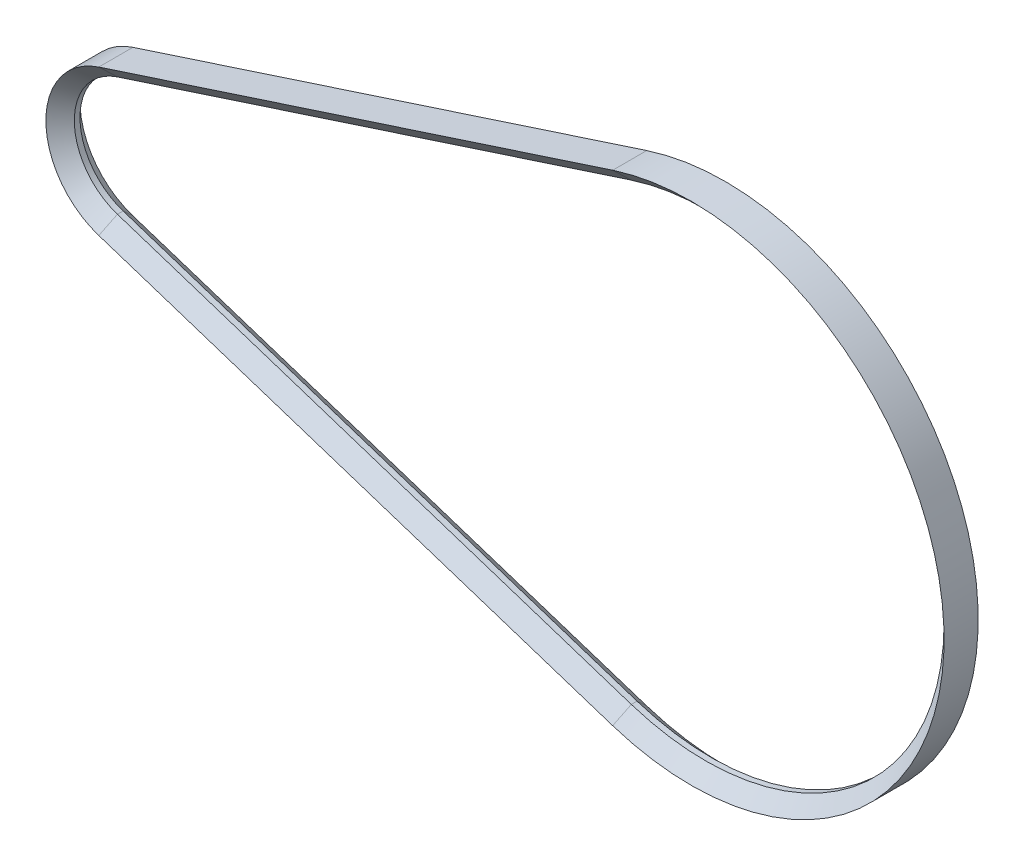
ISO-10303-21;
HEADER;
FILE_DESCRIPTION(('STEP AP214'),'2;1');
FILE_NAME('part.step','',(''),(''),'','','');
FILE_SCHEMA(('AUTOMOTIVE_DESIGN { 1 0 10303 214 1 1 1 1 }'));
ENDSEC;
DATA;
#1=APPLICATION_CONTEXT('core data for automotive mechanical design processes');
#2=APPLICATION_PROTOCOL_DEFINITION('international standard','automotive_design',2000,#1);
#3=PRODUCT_CONTEXT('',#1,'mechanical');
#4=PRODUCT('Part','Part','',(#3));
#5=PRODUCT_RELATED_PRODUCT_CATEGORY('part','',(#4));
#6=PRODUCT_DEFINITION_FORMATION('','',#4);
#7=PRODUCT_DEFINITION_CONTEXT('part definition',#1,'design');
#8=PRODUCT_DEFINITION('design','',#6,#7);
#9=PRODUCT_DEFINITION_SHAPE('','',#8);
#10=(LENGTH_UNIT() NAMED_UNIT(*) SI_UNIT(.MILLI.,.METRE.));
#11=(NAMED_UNIT(*) PLANE_ANGLE_UNIT() SI_UNIT($,.RADIAN.));
#12=(NAMED_UNIT(*) SI_UNIT($,.STERADIAN.) SOLID_ANGLE_UNIT());
#13=UNCERTAINTY_MEASURE_WITH_UNIT(LENGTH_MEASURE(1.E-05),#10,'distance_accuracy_value','');
#14=(GEOMETRIC_REPRESENTATION_CONTEXT(3) GLOBAL_UNCERTAINTY_ASSIGNED_CONTEXT((#13)) GLOBAL_UNIT_ASSIGNED_CONTEXT((#10,
#11,#12)) REPRESENTATION_CONTEXT('',''));
#15=CARTESIAN_POINT('',(0.,0.,0.));
#16=DIRECTION('',(0.,0.,1.));
#17=DIRECTION('',(1.,0.,0.));
#18=AXIS2_PLACEMENT_3D('',#15,#16,#17);
#19=CARTESIAN_POINT('',(86.2049999999994,42.307776767398,3.));
#20=DIRECTION('',(-0.219203102167829,0.672272266273119,-0.707106781186551));
#21=DIRECTION('',(0.,0.724732826664903,0.689029992057167));
#22=AXIS2_PLACEMENT_3D('',#19,#20,#21);
#23=PLANE('',#22);
#24=DIRECTION('',(0.219203102167841,-0.672272266273123,-0.707106781186544));
#25=VECTOR('',#24,1.);
#26=CARTESIAN_POINT('',(86.2049999999994,42.307776767398,3.));
#27=LINE('',#26,#25);
#28=CARTESIAN_POINT('',(86.2049999999994,42.307776767398,3.));
#29=VERTEX_POINT('',#28);
#30=CARTESIAN_POINT('',(86.9799999999994,39.9309353759711,0.500000000000023));
#31=VERTEX_POINT('',#30);
#32=EDGE_CURVE('E163',#29,#31,#27,.T.);
#33=ORIENTED_EDGE('',*,*,#32,.F.);
#34=DIRECTION('',(-0.950736556570746,-0.31,0.));
#35=VECTOR('',#34,1.);
#36=CARTESIAN_POINT('',(86.2049999999994,42.307776767398,3.));
#37=LINE('',#36,#35);
#38=CARTESIAN_POINT('',(-4.18500000000059,12.8349435137049,3.));
#39=VERTEX_POINT('',#38);
#40=EDGE_CURVE('E41',#29,#39,#37,.T.);
#41=ORIENTED_EDGE('',*,*,#40,.T.);
#42=DIRECTION('',(0.219203102167841,-0.672272266273123,-0.707106781186544));
#43=VECTOR('',#42,1.);
#44=CARTESIAN_POINT('',(-4.18500000000059,12.8349435137049,3.));
#45=LINE('',#44,#43);
#46=CARTESIAN_POINT('',(-3.41000000000057,10.458102122278,0.500000000000023));
#47=VERTEX_POINT('',#46);
#48=EDGE_CURVE('E184',#39,#47,#45,.T.);
#49=ORIENTED_EDGE('',*,*,#48,.T.);
#50=DIRECTION('',(-0.950736556570746,-0.31,0.));
#51=VECTOR('',#50,1.);
#52=CARTESIAN_POINT('',(86.9799999999994,39.9309353759711,0.500000000000023));
#53=LINE('',#52,#51);
#54=EDGE_CURVE('E11',#31,#47,#53,.T.);
#55=ORIENTED_EDGE('',*,*,#54,.F.);
#56=EDGE_LOOP('',(#33,#41,#49,#55));
#57=FACE_BOUND('',#56,.T.);
#58=ADVANCED_FACE('F33',(#57),#23,.F.);
#59=CARTESIAN_POINT('',(86.2049999999994,42.307776767398,3.));
#60=DIRECTION('',(0.31,-0.950736556570746,0.));
#61=DIRECTION('',(0.950736556570747,0.31,0.));
#62=AXIS2_PLACEMENT_3D('',#59,#60,#61);
#63=PLANE('',#62);
#64=DIRECTION('',(0.,0.,1.));
#65=VECTOR('',#64,1.);
#66=CARTESIAN_POINT('',(86.2049999999994,42.307776767398,3.));
#67=LINE('',#66,#65);
#68=CARTESIAN_POINT('',(86.2049999999994,42.307776767398,-3.));
#69=VERTEX_POINT('',#68);
#70=EDGE_CURVE('E160',#69,#29,#67,.T.);
#71=ORIENTED_EDGE('',*,*,#70,.F.);
#72=DIRECTION('',(-0.950736556570746,-0.31,0.));
#73=VECTOR('',#72,1.);
#74=CARTESIAN_POINT('',(86.2049999999994,42.307776767398,-3.));
#75=LINE('',#74,#73);
#76=CARTESIAN_POINT('',(-4.18500000000059,12.8349435137049,-3.));
#77=VERTEX_POINT('',#76);
#78=EDGE_CURVE('E190',#69,#77,#75,.T.);
#79=ORIENTED_EDGE('',*,*,#78,.T.);
#80=DIRECTION('',(0.,0.,1.));
#81=VECTOR('',#80,1.);
#82=CARTESIAN_POINT('',(-4.18500000000059,12.8349435137049,3.));
#83=LINE('',#82,#81);
#84=EDGE_CURVE('E181',#77,#39,#83,.T.);
#85=ORIENTED_EDGE('',*,*,#84,.T.);
#86=ORIENTED_EDGE('',*,*,#40,.F.);
#87=EDGE_LOOP('',(#71,#79,#85,#86));
#88=FACE_BOUND('',#87,.T.);
#89=ADVANCED_FACE('F209',(#88),#63,.F.);
#90=CARTESIAN_POINT('',(86.2049999999994,42.307776767398,-3.));
#91=DIRECTION('',(-0.219203102167829,0.67227226627312,0.70710678118655));
#92=DIRECTION('',(0.,-0.724732826664902,0.689029992057168));
#93=AXIS2_PLACEMENT_3D('',#90,#91,#92);
#94=PLANE('',#93);
#95=DIRECTION('',(-0.219203102167841,0.672272266273122,-0.707106781186545));
#96=VECTOR('',#95,1.);
#97=CARTESIAN_POINT('',(86.2049999999994,42.307776767398,-3.));
#98=LINE('',#97,#96);
#99=CARTESIAN_POINT('',(86.9799999999994,39.9309353759711,-0.500000000000021));
#100=VERTEX_POINT('',#99);
#101=EDGE_CURVE('E157',#100,#69,#98,.T.);
#102=ORIENTED_EDGE('',*,*,#101,.F.);
#103=DIRECTION('',(-0.950736556570746,-0.31,0.));
#104=VECTOR('',#103,1.);
#105=CARTESIAN_POINT('',(86.9799999999994,39.9309353759711,-0.500000000000021));
#106=LINE('',#105,#104);
#107=CARTESIAN_POINT('',(-3.41000000000057,10.458102122278,-0.500000000000021));
#108=VERTEX_POINT('',#107);
#109=EDGE_CURVE('E187',#100,#108,#106,.T.);
#110=ORIENTED_EDGE('',*,*,#109,.T.);
#111=DIRECTION('',(-0.219203102167841,0.672272266273122,-0.707106781186545));
#112=VECTOR('',#111,1.);
#113=CARTESIAN_POINT('',(-4.18500000000059,12.8349435137049,-3.));
#114=LINE('',#113,#112);
#115=EDGE_CURVE('E129',#108,#77,#114,.T.);
#116=ORIENTED_EDGE('',*,*,#115,.T.);
#117=ORIENTED_EDGE('',*,*,#78,.F.);
#118=EDGE_LOOP('',(#102,#110,#116,#117));
#119=FACE_BOUND('',#118,.T.);
#120=ADVANCED_FACE('F207',(#119),#94,.F.);
#121=CARTESIAN_POINT('',(86.9799999999994,39.9309353759711,-0.500000000000021));
#122=DIRECTION('',(-0.31,0.950736556570746,0.));
#123=DIRECTION('',(-0.950736556570747,-0.31,0.));
#124=AXIS2_PLACEMENT_3D('',#121,#122,#123);
#125=PLANE('',#124);
#126=DIRECTION('',(0.,0.,-1.));
#127=VECTOR('',#126,1.);
#128=CARTESIAN_POINT('',(86.9799999999994,39.9309353759711,-0.500000000000021));
#129=LINE('',#128,#127);
#130=EDGE_CURVE('E154',#31,#100,#129,.T.);
#131=ORIENTED_EDGE('',*,*,#130,.F.);
#132=ORIENTED_EDGE('',*,*,#54,.T.);
#133=DIRECTION('',(0.,0.,-1.));
#134=VECTOR('',#133,1.);
#135=CARTESIAN_POINT('',(-3.41000000000057,10.458102122278,-0.500000000000021));
#136=LINE('',#135,#134);
#137=EDGE_CURVE('E178',#47,#108,#136,.T.);
#138=ORIENTED_EDGE('',*,*,#137,.T.);
#139=ORIENTED_EDGE('',*,*,#109,.F.);
#140=EDGE_LOOP('',(#131,#132,#138,#139));
#141=FACE_BOUND('',#140,.T.);
#142=ADVANCED_FACE('F227',(#141),#125,.F.);
#143=CARTESIAN_POINT('',(100.,0.,3.));
#144=DIRECTION('',(0.,0.,1.));
#145=DIRECTION('',(1.,0.,0.));
#146=AXIS2_PLACEMENT_3D('',#143,#144,#145);
#147=CONICAL_SURFACE('',#146,44.5,0.785398163397454);
#148=DIRECTION('',(0.21920310216783,0.672272266273126,-0.707106781186544));
#149=VECTOR('',#148,1.);
#150=CARTESIAN_POINT('',(86.205,-42.3077767673982,3.));
#151=LINE('',#150,#149);
#152=CARTESIAN_POINT('',(86.205,-42.3077767673982,3.));
#153=VERTEX_POINT('',#152);
#154=CARTESIAN_POINT('',(86.98,-39.9309353759713,0.500000000000023));
#155=VERTEX_POINT('',#154);
#156=EDGE_CURVE('E114',#153,#155,#151,.T.);
#157=ORIENTED_EDGE('',*,*,#156,.F.);
#158=CARTESIAN_POINT('',(100.,0.,3.));
#159=DIRECTION('',(0.,0.,1.));
#160=DIRECTION('',(1.,0.,0.));
#161=AXIS2_PLACEMENT_3D('',#158,#159,#160);
#162=CIRCLE('',#161,44.5);
#163=EDGE_CURVE('E172',#153,#29,#162,.T.);
#164=ORIENTED_EDGE('',*,*,#163,.T.);
#165=ORIENTED_EDGE('',*,*,#32,.T.);
#166=CARTESIAN_POINT('',(100.,0.,0.500000000000023));
#167=DIRECTION('',(0.,0.,1.));
#168=DIRECTION('',(1.,0.,0.));
#169=AXIS2_PLACEMENT_3D('',#166,#167,#168);
#170=CIRCLE('',#169,42.);
#171=EDGE_CURVE('E175',#155,#31,#170,.T.);
#172=ORIENTED_EDGE('',*,*,#171,.F.);
#173=EDGE_LOOP('',(#157,#164,#165,#172));
#174=FACE_BOUND('',#173,.T.);
#175=ADVANCED_FACE('F230',(#174),#147,.F.);
#176=CARTESIAN_POINT('',(100.,0.,0.));
#177=DIRECTION('',(0.,0.,1.));
#178=DIRECTION('',(1.,0.,0.));
#179=AXIS2_PLACEMENT_3D('',#176,#177,#178);
#180=CYLINDRICAL_SURFACE('',#179,44.5);
#181=DIRECTION('',(0.,0.,1.));
#182=VECTOR('',#181,1.);
#183=CARTESIAN_POINT('',(86.205,-42.3077767673982,3.));
#184=LINE('',#183,#182);
#185=CARTESIAN_POINT('',(86.205,-42.3077767673982,-3.));
#186=VERTEX_POINT('',#185);
#187=EDGE_CURVE('E143',#186,#153,#184,.T.);
#188=ORIENTED_EDGE('',*,*,#187,.F.);
#189=CARTESIAN_POINT('',(100.,0.,-3.));
#190=DIRECTION('',(0.,0.,1.));
#191=DIRECTION('',(1.,0.,0.));
#192=AXIS2_PLACEMENT_3D('',#189,#190,#191);
#193=CIRCLE('',#192,44.5);
#194=EDGE_CURVE('E169',#186,#69,#193,.T.);
#195=ORIENTED_EDGE('',*,*,#194,.T.);
#196=ORIENTED_EDGE('',*,*,#70,.T.);
#197=ORIENTED_EDGE('',*,*,#163,.F.);
#198=EDGE_LOOP('',(#188,#195,#196,#197));
#199=FACE_BOUND('',#198,.T.);
#200=ADVANCED_FACE('F216',(#199),#180,.T.);
#201=CARTESIAN_POINT('',(100.,0.,-0.500000000000021));
#202=DIRECTION('',(0.,0.,-1.));
#203=DIRECTION('',(-1.,0.,0.));
#204=AXIS2_PLACEMENT_3D('',#201,#202,#203);
#205=CONICAL_SURFACE('',#204,42.,0.785398163397453);
#206=DIRECTION('',(-0.21920310216783,-0.672272266273125,-0.707106781186545));
#207=VECTOR('',#206,1.);
#208=CARTESIAN_POINT('',(86.205,-42.3077767673982,-3.));
#209=LINE('',#208,#207);
#210=CARTESIAN_POINT('',(86.98,-39.9309353759713,-0.500000000000021));
#211=VERTEX_POINT('',#210);
#212=EDGE_CURVE('E141',#211,#186,#209,.T.);
#213=ORIENTED_EDGE('',*,*,#212,.F.);
#214=CARTESIAN_POINT('',(100.,0.,-0.500000000000021));
#215=DIRECTION('',(0.,0.,1.));
#216=DIRECTION('',(1.,0.,0.));
#217=AXIS2_PLACEMENT_3D('',#214,#215,#216);
#218=CIRCLE('',#217,42.);
#219=EDGE_CURVE('E166',#211,#100,#218,.T.);
#220=ORIENTED_EDGE('',*,*,#219,.T.);
#221=ORIENTED_EDGE('',*,*,#101,.T.);
#222=ORIENTED_EDGE('',*,*,#194,.F.);
#223=EDGE_LOOP('',(#213,#220,#221,#222));
#224=FACE_BOUND('',#223,.T.);
#225=ADVANCED_FACE('F214',(#224),#205,.F.);
#226=CARTESIAN_POINT('',(100.,0.,0.));
#227=DIRECTION('',(0.,0.,1.));
#228=DIRECTION('',(1.,0.,0.));
#229=AXIS2_PLACEMENT_3D('',#226,#227,#228);
#230=CYLINDRICAL_SURFACE('',#229,42.);
#231=DIRECTION('',(0.,0.,-1.));
#232=VECTOR('',#231,1.);
#233=CARTESIAN_POINT('',(86.98,-39.9309353759713,-0.500000000000021));
#234=LINE('',#233,#232);
#235=EDGE_CURVE('E110',#155,#211,#234,.T.);
#236=ORIENTED_EDGE('',*,*,#235,.F.);
#237=ORIENTED_EDGE('',*,*,#171,.T.);
#238=ORIENTED_EDGE('',*,*,#130,.T.);
#239=ORIENTED_EDGE('',*,*,#219,.F.);
#240=EDGE_LOOP('',(#236,#237,#238,#239));
#241=FACE_BOUND('',#240,.T.);
#242=ADVANCED_FACE('F231',(#241),#230,.F.);
#243=CARTESIAN_POINT('',(-4.18499999999999,-12.8349435137051,3.));
#244=DIRECTION('',(-0.219203102167828,-0.672272266273119,-0.707106781186551));
#245=DIRECTION('',(0.,0.724732826664903,-0.689029992057167));
#246=AXIS2_PLACEMENT_3D('',#243,#244,#245);
#247=PLANE('',#246);
#248=DIRECTION('',(0.21920310216783,0.672272266273126,-0.707106781186544));
#249=VECTOR('',#248,1.);
#250=CARTESIAN_POINT('',(-4.18499999999999,-12.8349435137051,3.));
#251=LINE('',#250,#249);
#252=CARTESIAN_POINT('',(-4.18499999999999,-12.8349435137051,3.));
#253=VERTEX_POINT('',#252);
#254=CARTESIAN_POINT('',(-3.40999999999999,-10.4581021222782,0.500000000000023));
#255=VERTEX_POINT('',#254);
#256=EDGE_CURVE('E138',#253,#255,#251,.T.);
#257=ORIENTED_EDGE('',*,*,#256,.F.);
#258=DIRECTION('',(0.950736556570746,-0.31,0.));
#259=VECTOR('',#258,1.);
#260=CARTESIAN_POINT('',(-4.18499999999999,-12.8349435137051,3.));
#261=LINE('',#260,#259);
#262=EDGE_CURVE('E149',#253,#153,#261,.T.);
#263=ORIENTED_EDGE('',*,*,#262,.T.);
#264=ORIENTED_EDGE('',*,*,#156,.T.);
#265=DIRECTION('',(0.950736556570746,-0.31,0.));
#266=VECTOR('',#265,1.);
#267=CARTESIAN_POINT('',(-3.40999999999999,-10.4581021222782,0.500000000000023));
#268=LINE('',#267,#266);
#269=EDGE_CURVE('E152',#255,#155,#268,.T.);
#270=ORIENTED_EDGE('',*,*,#269,.F.);
#271=EDGE_LOOP('',(#257,#263,#264,#270));
#272=FACE_BOUND('',#271,.T.);
#273=ADVANCED_FACE('F222',(#272),#247,.F.);
#274=CARTESIAN_POINT('',(-4.18499999999999,-12.8349435137051,3.));
#275=DIRECTION('',(0.31,0.950736556570746,0.));
#276=DIRECTION('',(-0.950736556570747,0.31,0.));
#277=AXIS2_PLACEMENT_3D('',#274,#275,#276);
#278=PLANE('',#277);
#279=DIRECTION('',(0.,0.,1.));
#280=VECTOR('',#279,1.);
#281=CARTESIAN_POINT('',(-4.18499999999999,-12.8349435137051,3.));
#282=LINE('',#281,#280);
#283=CARTESIAN_POINT('',(-4.18499999999999,-12.8349435137051,-3.));
#284=VERTEX_POINT('',#283);
#285=EDGE_CURVE('E123',#284,#253,#282,.T.);
#286=ORIENTED_EDGE('',*,*,#285,.F.);
#287=DIRECTION('',(0.950736556570746,-0.31,0.));
#288=VECTOR('',#287,1.);
#289=CARTESIAN_POINT('',(-4.18499999999999,-12.8349435137051,-3.));
#290=LINE('',#289,#288);
#291=EDGE_CURVE('E113',#284,#186,#290,.T.);
#292=ORIENTED_EDGE('',*,*,#291,.T.);
#293=ORIENTED_EDGE('',*,*,#187,.T.);
#294=ORIENTED_EDGE('',*,*,#262,.F.);
#295=EDGE_LOOP('',(#286,#292,#293,#294));
#296=FACE_BOUND('',#295,.T.);
#297=ADVANCED_FACE('F219',(#296),#278,.F.);
#298=CARTESIAN_POINT('',(-4.18499999999999,-12.8349435137051,-3.));
#299=DIRECTION('',(-0.219203102167829,-0.67227226627312,0.70710678118655));
#300=DIRECTION('',(0.,-0.724732826664902,-0.689029992057168));
#301=AXIS2_PLACEMENT_3D('',#298,#299,#300);
#302=PLANE('',#301);
#303=DIRECTION('',(-0.21920310216783,-0.672272266273125,-0.707106781186545));
#304=VECTOR('',#303,1.);
#305=CARTESIAN_POINT('',(-4.18499999999999,-12.8349435137051,-3.));
#306=LINE('',#305,#304);
#307=CARTESIAN_POINT('',(-3.40999999999999,-10.4581021222782,-0.500000000000021));
#308=VERTEX_POINT('',#307);
#309=EDGE_CURVE('E117',#308,#284,#306,.T.);
#310=ORIENTED_EDGE('',*,*,#309,.F.);
#311=DIRECTION('',(0.950736556570746,-0.31,0.));
#312=VECTOR('',#311,1.);
#313=CARTESIAN_POINT('',(-3.40999999999999,-10.4581021222782,-0.500000000000021));
#314=LINE('',#313,#312);
#315=EDGE_CURVE('E103',#308,#211,#314,.T.);
#316=ORIENTED_EDGE('',*,*,#315,.T.);
#317=ORIENTED_EDGE('',*,*,#212,.T.);
#318=ORIENTED_EDGE('',*,*,#291,.F.);
#319=EDGE_LOOP('',(#310,#316,#317,#318));
#320=FACE_BOUND('',#319,.T.);
#321=ADVANCED_FACE('F119',(#320),#302,.F.);
#322=CARTESIAN_POINT('',(-3.40999999999999,-10.4581021222782,-0.500000000000021));
#323=DIRECTION('',(-0.31,-0.950736556570746,0.));
#324=DIRECTION('',(0.950736556570747,-0.31,0.));
#325=AXIS2_PLACEMENT_3D('',#322,#323,#324);
#326=PLANE('',#325);
#327=DIRECTION('',(0.,0.,-1.));
#328=VECTOR('',#327,1.);
#329=CARTESIAN_POINT('',(-3.40999999999999,-10.4581021222782,-0.500000000000021));
#330=LINE('',#329,#328);
#331=EDGE_CURVE('E108',#255,#308,#330,.T.);
#332=ORIENTED_EDGE('',*,*,#331,.F.);
#333=ORIENTED_EDGE('',*,*,#269,.T.);
#334=ORIENTED_EDGE('',*,*,#235,.T.);
#335=ORIENTED_EDGE('',*,*,#315,.F.);
#336=EDGE_LOOP('',(#332,#333,#334,#335));
#337=FACE_BOUND('',#336,.T.);
#338=ADVANCED_FACE('F105',(#337),#326,.F.);
#339=CARTESIAN_POINT('',(0.,0.,0.));
#340=DIRECTION('',(0.,0.,-1.));
#341=DIRECTION('',(-1.,0.,0.));
#342=AXIS2_PLACEMENT_3D('',#339,#340,#341);
#343=CYLINDRICAL_SURFACE('',#342,11.);
#344=CARTESIAN_POINT('',(0.,0.,-0.500000000000021));
#345=DIRECTION('',(0.,0.,-1.));
#346=DIRECTION('',(-1.,0.,0.));
#347=AXIS2_PLACEMENT_3D('',#344,#345,#346);
#348=CIRCLE('',#347,11.);
#349=EDGE_CURVE('E126',#308,#108,#348,.T.);
#350=ORIENTED_EDGE('',*,*,#349,.T.);
#351=ORIENTED_EDGE('',*,*,#137,.F.);
#352=CARTESIAN_POINT('',(0.,0.,0.500000000000023));
#353=DIRECTION('',(0.,0.,-1.));
#354=DIRECTION('',(-1.,0.,0.));
#355=AXIS2_PLACEMENT_3D('',#352,#353,#354);
#356=CIRCLE('',#355,11.);
#357=EDGE_CURVE('E49',#255,#47,#356,.T.);
#358=ORIENTED_EDGE('',*,*,#357,.F.);
#359=ORIENTED_EDGE('',*,*,#331,.T.);
#360=EDGE_LOOP('',(#350,#351,#358,#359));
#361=FACE_BOUND('',#360,.T.);
#362=ADVANCED_FACE('F134',(#361),#343,.F.);
#363=CARTESIAN_POINT('',(0.,0.,-0.500000000000021));
#364=DIRECTION('',(0.,0.,-1.));
#365=DIRECTION('',(-1.,0.,0.));
#366=AXIS2_PLACEMENT_3D('',#363,#364,#365);
#367=CONICAL_SURFACE('',#366,11.,0.785398163397453);
#368=CARTESIAN_POINT('',(0.,0.,-3.));
#369=DIRECTION('',(0.,0.,-1.));
#370=DIRECTION('',(-1.,0.,0.));
#371=AXIS2_PLACEMENT_3D('',#368,#369,#370);
#372=CIRCLE('',#371,13.5);
#373=EDGE_CURVE('E132',#284,#77,#372,.T.);
#374=ORIENTED_EDGE('',*,*,#373,.T.);
#375=ORIENTED_EDGE('',*,*,#115,.F.);
#376=ORIENTED_EDGE('',*,*,#349,.F.);
#377=ORIENTED_EDGE('',*,*,#309,.T.);
#378=EDGE_LOOP('',(#374,#375,#376,#377));
#379=FACE_BOUND('',#378,.T.);
#380=ADVANCED_FACE('F127',(#379),#367,.F.);
#381=CARTESIAN_POINT('',(0.,0.,0.));
#382=DIRECTION('',(0.,0.,-1.));
#383=DIRECTION('',(-1.,0.,0.));
#384=AXIS2_PLACEMENT_3D('',#381,#382,#383);
#385=CYLINDRICAL_SURFACE('',#384,13.5);
#386=CARTESIAN_POINT('',(0.,0.,3.));
#387=DIRECTION('',(0.,0.,-1.));
#388=DIRECTION('',(-1.,0.,0.));
#389=AXIS2_PLACEMENT_3D('',#386,#387,#388);
#390=CIRCLE('',#389,13.5);
#391=EDGE_CURVE('E57',#253,#39,#390,.T.);
#392=ORIENTED_EDGE('',*,*,#391,.T.);
#393=ORIENTED_EDGE('',*,*,#84,.F.);
#394=ORIENTED_EDGE('',*,*,#373,.F.);
#395=ORIENTED_EDGE('',*,*,#285,.T.);
#396=EDGE_LOOP('',(#392,#393,#394,#395));
#397=FACE_BOUND('',#396,.T.);
#398=ADVANCED_FACE('F203',(#397),#385,.T.);
#399=CARTESIAN_POINT('',(0.,0.,3.));
#400=DIRECTION('',(0.,0.,1.));
#401=DIRECTION('',(1.,0.,0.));
#402=AXIS2_PLACEMENT_3D('',#399,#400,#401);
#403=CONICAL_SURFACE('',#402,13.5,0.785398163397454);
#404=ORIENTED_EDGE('',*,*,#256,.T.);
#405=ORIENTED_EDGE('',*,*,#357,.T.);
#406=ORIENTED_EDGE('',*,*,#48,.F.);
#407=ORIENTED_EDGE('',*,*,#391,.F.);
#408=EDGE_LOOP('',(#404,#405,#406,#407));
#409=FACE_BOUND('',#408,.T.);
#410=ADVANCED_FACE('F223',(#409),#403,.F.);
#411=CLOSED_SHELL('',(#58,#89,#120,#142,#175,#200,#225,#242,#273,#297,#321,#338,#362,#380,#398,#410));
#412=MANIFOLD_SOLID_BREP('B2',#411);
#413=ADVANCED_BREP_SHAPE_REPRESENTATION('',(#18,#412),#14);
#414=SHAPE_DEFINITION_REPRESENTATION(#9,#413);
ENDSEC;
END-ISO-10303-21;
